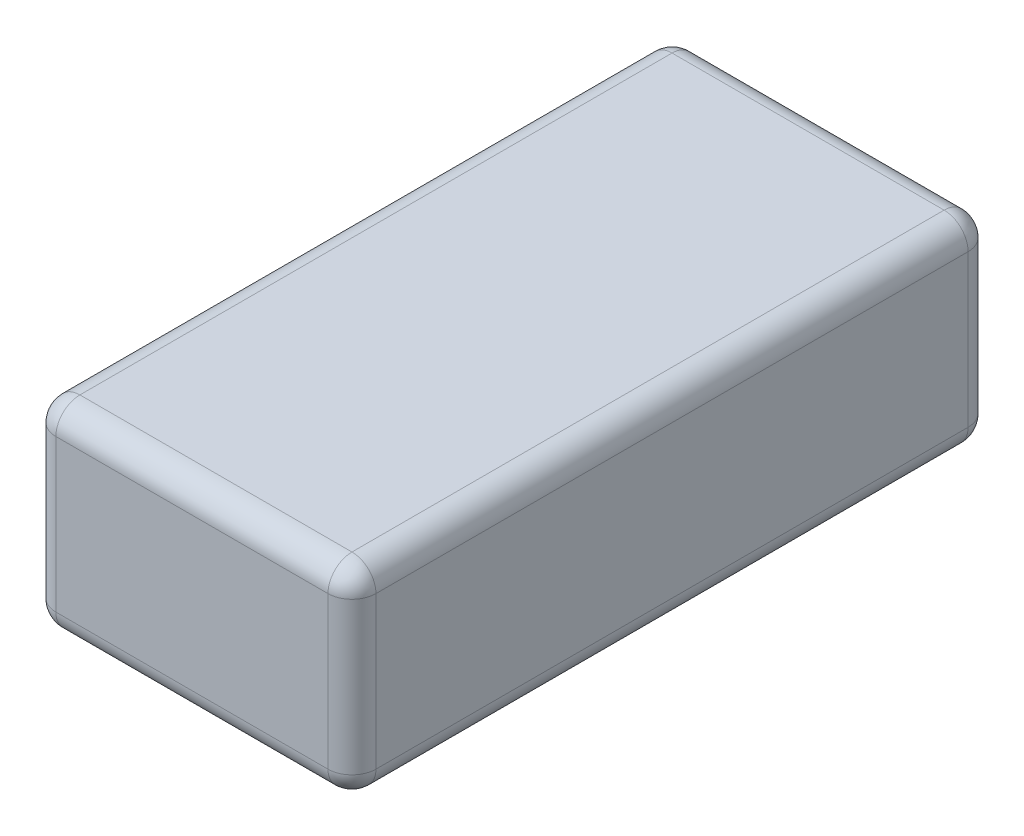
ISO-10303-21;
HEADER;
FILE_DESCRIPTION(('STEP AP214'),'2;1');
FILE_NAME('part.step','',(''),(''),'','','');
FILE_SCHEMA(('AUTOMOTIVE_DESIGN { 1 0 10303 214 1 1 1 1 }'));
ENDSEC;
DATA;
#1=APPLICATION_CONTEXT('core data for automotive mechanical design processes');
#2=APPLICATION_PROTOCOL_DEFINITION('international standard','automotive_design',2000,#1);
#3=PRODUCT_CONTEXT('',#1,'mechanical');
#4=PRODUCT('Part','Part','',(#3));
#5=PRODUCT_RELATED_PRODUCT_CATEGORY('part','',(#4));
#6=PRODUCT_DEFINITION_FORMATION('','',#4);
#7=PRODUCT_DEFINITION_CONTEXT('part definition',#1,'design');
#8=PRODUCT_DEFINITION('design','',#6,#7);
#9=PRODUCT_DEFINITION_SHAPE('','',#8);
#10=(LENGTH_UNIT() NAMED_UNIT(*) SI_UNIT(.MILLI.,.METRE.));
#11=(NAMED_UNIT(*) PLANE_ANGLE_UNIT() SI_UNIT($,.RADIAN.));
#12=(NAMED_UNIT(*) SI_UNIT($,.STERADIAN.) SOLID_ANGLE_UNIT());
#13=UNCERTAINTY_MEASURE_WITH_UNIT(LENGTH_MEASURE(1.E-05),#10,'distance_accuracy_value','');
#14=(GEOMETRIC_REPRESENTATION_CONTEXT(3) GLOBAL_UNCERTAINTY_ASSIGNED_CONTEXT((#13)) GLOBAL_UNIT_ASSIGNED_CONTEXT((#10,
#11,#12)) REPRESENTATION_CONTEXT('',''));
#15=CARTESIAN_POINT('',(0.,0.,0.));
#16=DIRECTION('',(0.,0.,1.));
#17=DIRECTION('',(1.,0.,0.));
#18=AXIS2_PLACEMENT_3D('',#15,#16,#17);
#19=CARTESIAN_POINT('',(20.,25.,-40.));
#20=DIRECTION('',(-1.,0.,0.));
#21=DIRECTION('',(0.,0.,1.));
#22=AXIS2_PLACEMENT_3D('',#19,#20,#21);
#23=PLANE('',#22);
#24=DIRECTION('',(0.,-1.,0.));
#25=VECTOR('',#24,1.);
#26=CARTESIAN_POINT('',(20.,25.,-37.));
#27=LINE('',#26,#25);
#28=CARTESIAN_POINT('',(20.,3.,-37.));
#29=VERTEX_POINT('',#28);
#30=CARTESIAN_POINT('',(20.,22.,-37.));
#31=VERTEX_POINT('',#30);
#32=EDGE_CURVE('E133',#29,#31,#27,.F.);
#33=ORIENTED_EDGE('',*,*,#32,.T.);
#34=DIRECTION('',(0.,0.,-1.));
#35=VECTOR('',#34,1.);
#36=CARTESIAN_POINT('',(20.,22.,40.));
#37=LINE('',#36,#35);
#38=CARTESIAN_POINT('',(20.,22.,37.));
#39=VERTEX_POINT('',#38);
#40=EDGE_CURVE('E170',#31,#39,#37,.F.);
#41=ORIENTED_EDGE('',*,*,#40,.T.);
#42=DIRECTION('',(0.,-1.,0.));
#43=VECTOR('',#42,1.);
#44=CARTESIAN_POINT('',(20.,25.,37.));
#45=LINE('',#44,#43);
#46=CARTESIAN_POINT('',(20.,3.,37.));
#47=VERTEX_POINT('',#46);
#48=EDGE_CURVE('E167',#39,#47,#45,.T.);
#49=ORIENTED_EDGE('',*,*,#48,.T.);
#50=DIRECTION('',(0.,0.,-1.));
#51=VECTOR('',#50,1.);
#52=CARTESIAN_POINT('',(20.,3.,-40.));
#53=LINE('',#52,#51);
#54=EDGE_CURVE('E162',#47,#29,#53,.T.);
#55=ORIENTED_EDGE('',*,*,#54,.T.);
#56=EDGE_LOOP('',(#33,#41,#49,#55));
#57=FACE_BOUND('',#56,.T.);
#58=ADVANCED_FACE('F38',(#57),#23,.F.);
#59=CARTESIAN_POINT('',(-20.,25.,-40.));
#60=DIRECTION('',(0.,0.,1.));
#61=DIRECTION('',(1.,0.,0.));
#62=AXIS2_PLACEMENT_3D('',#59,#60,#61);
#63=PLANE('',#62);
#64=DIRECTION('',(0.,-1.,0.));
#65=VECTOR('',#64,1.);
#66=CARTESIAN_POINT('',(-17.,25.,-40.));
#67=LINE('',#66,#65);
#68=CARTESIAN_POINT('',(-17.,3.,-40.));
#69=VERTEX_POINT('',#68);
#70=CARTESIAN_POINT('',(-17.,22.,-40.));
#71=VERTEX_POINT('',#70);
#72=EDGE_CURVE('E155',#69,#71,#67,.F.);
#73=ORIENTED_EDGE('',*,*,#72,.T.);
#74=DIRECTION('',(-1.,0.,0.));
#75=VECTOR('',#74,1.);
#76=CARTESIAN_POINT('',(20.,22.,-40.));
#77=LINE('',#76,#75);
#78=CARTESIAN_POINT('',(17.,22.,-40.));
#79=VERTEX_POINT('',#78);
#80=EDGE_CURVE('E159',#71,#79,#77,.F.);
#81=ORIENTED_EDGE('',*,*,#80,.T.);
#82=DIRECTION('',(0.,-1.,0.));
#83=VECTOR('',#82,1.);
#84=CARTESIAN_POINT('',(17.,25.,-40.));
#85=LINE('',#84,#83);
#86=CARTESIAN_POINT('',(17.,3.,-40.));
#87=VERTEX_POINT('',#86);
#88=EDGE_CURVE('E131',#79,#87,#85,.T.);
#89=ORIENTED_EDGE('',*,*,#88,.T.);
#90=DIRECTION('',(-1.,0.,0.));
#91=VECTOR('',#90,1.);
#92=CARTESIAN_POINT('',(-20.,3.,-40.));
#93=LINE('',#92,#91);
#94=EDGE_CURVE('E149',#87,#69,#93,.T.);
#95=ORIENTED_EDGE('',*,*,#94,.T.);
#96=EDGE_LOOP('',(#73,#81,#89,#95));
#97=FACE_BOUND('',#96,.T.);
#98=ADVANCED_FACE('F157',(#97),#63,.F.);
#99=CARTESIAN_POINT('',(-20.,25.,-40.));
#100=DIRECTION('',(1.,0.,0.));
#101=DIRECTION('',(0.,0.,-1.));
#102=AXIS2_PLACEMENT_3D('',#99,#100,#101);
#103=PLANE('',#102);
#104=DIRECTION('',(0.,-1.,0.));
#105=VECTOR('',#104,1.);
#106=CARTESIAN_POINT('',(-20.,25.,37.));
#107=LINE('',#106,#105);
#108=CARTESIAN_POINT('',(-20.,3.,37.));
#109=VERTEX_POINT('',#108);
#110=CARTESIAN_POINT('',(-20.,22.,37.));
#111=VERTEX_POINT('',#110);
#112=EDGE_CURVE('E174',#109,#111,#107,.F.);
#113=ORIENTED_EDGE('',*,*,#112,.T.);
#114=DIRECTION('',(0.,0.,1.));
#115=VECTOR('',#114,1.);
#116=CARTESIAN_POINT('',(-20.,22.,-40.));
#117=LINE('',#116,#115);
#118=CARTESIAN_POINT('',(-20.,22.,-37.));
#119=VERTEX_POINT('',#118);
#120=EDGE_CURVE('E179',#111,#119,#117,.F.);
#121=ORIENTED_EDGE('',*,*,#120,.T.);
#122=DIRECTION('',(0.,-1.,0.));
#123=VECTOR('',#122,1.);
#124=CARTESIAN_POINT('',(-20.,25.,-37.));
#125=LINE('',#124,#123);
#126=CARTESIAN_POINT('',(-20.,3.,-37.));
#127=VERTEX_POINT('',#126);
#128=EDGE_CURVE('E176',#119,#127,#125,.T.);
#129=ORIENTED_EDGE('',*,*,#128,.T.);
#130=DIRECTION('',(0.,0.,1.));
#131=VECTOR('',#130,1.);
#132=CARTESIAN_POINT('',(-20.,3.,-40.));
#133=LINE('',#132,#131);
#134=EDGE_CURVE('E172',#127,#109,#133,.T.);
#135=ORIENTED_EDGE('',*,*,#134,.T.);
#136=EDGE_LOOP('',(#113,#121,#129,#135));
#137=FACE_BOUND('',#136,.T.);
#138=ADVANCED_FACE('F284',(#137),#103,.F.);
#139=CARTESIAN_POINT('',(-20.,25.,40.));
#140=DIRECTION('',(0.,0.,-1.));
#141=DIRECTION('',(-1.,0.,0.));
#142=AXIS2_PLACEMENT_3D('',#139,#140,#141);
#143=PLANE('',#142);
#144=DIRECTION('',(0.,-1.,0.));
#145=VECTOR('',#144,1.);
#146=CARTESIAN_POINT('',(17.,25.,40.));
#147=LINE('',#146,#145);
#148=CARTESIAN_POINT('',(17.,3.,40.));
#149=VERTEX_POINT('',#148);
#150=CARTESIAN_POINT('',(17.,22.,40.));
#151=VERTEX_POINT('',#150);
#152=EDGE_CURVE('E183',#149,#151,#147,.F.);
#153=ORIENTED_EDGE('',*,*,#152,.T.);
#154=DIRECTION('',(1.,0.,0.));
#155=VECTOR('',#154,1.);
#156=CARTESIAN_POINT('',(-20.,22.,40.));
#157=LINE('',#156,#155);
#158=CARTESIAN_POINT('',(-17.,22.,40.));
#159=VERTEX_POINT('',#158);
#160=EDGE_CURVE('E188',#151,#159,#157,.F.);
#161=ORIENTED_EDGE('',*,*,#160,.T.);
#162=DIRECTION('',(0.,-1.,0.));
#163=VECTOR('',#162,1.);
#164=CARTESIAN_POINT('',(-17.,25.,40.));
#165=LINE('',#164,#163);
#166=CARTESIAN_POINT('',(-17.,3.,40.));
#167=VERTEX_POINT('',#166);
#168=EDGE_CURVE('E185',#159,#167,#165,.T.);
#169=ORIENTED_EDGE('',*,*,#168,.T.);
#170=DIRECTION('',(1.,0.,0.));
#171=VECTOR('',#170,1.);
#172=CARTESIAN_POINT('',(-20.,3.,40.));
#173=LINE('',#172,#171);
#174=EDGE_CURVE('E181',#167,#149,#173,.T.);
#175=ORIENTED_EDGE('',*,*,#174,.T.);
#176=EDGE_LOOP('',(#153,#161,#169,#175));
#177=FACE_BOUND('',#176,.T.);
#178=ADVANCED_FACE('F294',(#177),#143,.F.);
#179=CARTESIAN_POINT('',(0.,25.,0.));
#180=DIRECTION('',(0.,1.,0.));
#181=DIRECTION('',(0.,0.,1.));
#182=AXIS2_PLACEMENT_3D('',#179,#180,#181);
#183=PLANE('',#182);
#184=DIRECTION('',(0.,0.,1.));
#185=VECTOR('',#184,1.);
#186=CARTESIAN_POINT('',(-17.,25.,40.));
#187=LINE('',#186,#185);
#188=CARTESIAN_POINT('',(-17.,25.,-37.));
#189=VERTEX_POINT('',#188);
#190=CARTESIAN_POINT('',(-17.,25.,37.));
#191=VERTEX_POINT('',#190);
#192=EDGE_CURVE('E194',#189,#191,#187,.T.);
#193=ORIENTED_EDGE('',*,*,#192,.T.);
#194=DIRECTION('',(1.,0.,0.));
#195=VECTOR('',#194,1.);
#196=CARTESIAN_POINT('',(20.,25.,37.));
#197=LINE('',#196,#195);
#198=CARTESIAN_POINT('',(17.,25.,37.));
#199=VERTEX_POINT('',#198);
#200=EDGE_CURVE('E196',#191,#199,#197,.T.);
#201=ORIENTED_EDGE('',*,*,#200,.T.);
#202=DIRECTION('',(0.,0.,-1.));
#203=VECTOR('',#202,1.);
#204=CARTESIAN_POINT('',(17.,25.,-40.));
#205=LINE('',#204,#203);
#206=CARTESIAN_POINT('',(17.,25.,-37.));
#207=VERTEX_POINT('',#206);
#208=EDGE_CURVE('E190',#199,#207,#205,.T.);
#209=ORIENTED_EDGE('',*,*,#208,.T.);
#210=DIRECTION('',(-1.,0.,0.));
#211=VECTOR('',#210,1.);
#212=CARTESIAN_POINT('',(-20.,25.,-37.));
#213=LINE('',#212,#211);
#214=EDGE_CURVE('E192',#207,#189,#213,.T.);
#215=ORIENTED_EDGE('',*,*,#214,.T.);
#216=EDGE_LOOP('',(#193,#201,#209,#215));
#217=FACE_BOUND('',#216,.T.);
#218=ADVANCED_FACE('F276',(#217),#183,.T.);
#219=CARTESIAN_POINT('',(0.,0.,0.));
#220=DIRECTION('',(0.,1.,0.));
#221=DIRECTION('',(0.,0.,1.));
#222=AXIS2_PLACEMENT_3D('',#219,#220,#221);
#223=PLANE('',#222);
#224=DIRECTION('',(0.,0.,-1.));
#225=VECTOR('',#224,1.);
#226=CARTESIAN_POINT('',(17.,0.,0.));
#227=LINE('',#226,#225);
#228=CARTESIAN_POINT('',(17.,0.,-37.));
#229=VERTEX_POINT('',#228);
#230=CARTESIAN_POINT('',(17.,0.,37.));
#231=VERTEX_POINT('',#230);
#232=EDGE_CURVE('E199',#229,#231,#227,.F.);
#233=ORIENTED_EDGE('',*,*,#232,.T.);
#234=DIRECTION('',(1.,0.,0.));
#235=VECTOR('',#234,1.);
#236=CARTESIAN_POINT('',(0.,0.,37.));
#237=LINE('',#236,#235);
#238=CARTESIAN_POINT('',(-17.,0.,37.));
#239=VERTEX_POINT('',#238);
#240=EDGE_CURVE('E11',#231,#239,#237,.F.);
#241=ORIENTED_EDGE('',*,*,#240,.T.);
#242=DIRECTION('',(0.,0.,1.));
#243=VECTOR('',#242,1.);
#244=CARTESIAN_POINT('',(-17.,0.,0.));
#245=LINE('',#244,#243);
#246=CARTESIAN_POINT('',(-17.,0.,-37.));
#247=VERTEX_POINT('',#246);
#248=EDGE_CURVE('E47',#239,#247,#245,.F.);
#249=ORIENTED_EDGE('',*,*,#248,.T.);
#250=DIRECTION('',(-1.,0.,0.));
#251=VECTOR('',#250,1.);
#252=CARTESIAN_POINT('',(0.,0.,-37.));
#253=LINE('',#252,#251);
#254=EDGE_CURVE('E201',#247,#229,#253,.F.);
#255=ORIENTED_EDGE('',*,*,#254,.T.);
#256=EDGE_LOOP('',(#233,#241,#249,#255));
#257=FACE_BOUND('',#256,.T.);
#258=ADVANCED_FACE('F521',(#257),#223,.F.);
#259=CARTESIAN_POINT('',(-17.,25.,37.));
#260=DIRECTION('',(0.,-1.,0.));
#261=DIRECTION('',(0.,0.,-1.));
#262=AXIS2_PLACEMENT_3D('',#259,#260,#261);
#263=CYLINDRICAL_SURFACE('',#262,3.);
#264=CARTESIAN_POINT('',(-17.,22.,37.));
#265=DIRECTION('',(0.,1.,0.));
#266=DIRECTION('',(0.,0.,1.));
#267=AXIS2_PLACEMENT_3D('',#264,#265,#266);
#268=CIRCLE('',#267,3.);
#269=EDGE_CURVE('E42',#111,#159,#268,.T.);
#270=ORIENTED_EDGE('',*,*,#269,.F.);
#271=ORIENTED_EDGE('',*,*,#112,.F.);
#272=CARTESIAN_POINT('',(-17.,3.,37.));
#273=DIRECTION('',(0.,-1.,0.));
#274=DIRECTION('',(0.,0.,-1.));
#275=AXIS2_PLACEMENT_3D('',#272,#273,#274);
#276=CIRCLE('',#275,3.);
#277=EDGE_CURVE('E254',#167,#109,#276,.T.);
#278=ORIENTED_EDGE('',*,*,#277,.F.);
#279=ORIENTED_EDGE('',*,*,#168,.F.);
#280=EDGE_LOOP('',(#270,#271,#278,#279));
#281=FACE_BOUND('',#280,.T.);
#282=ADVANCED_FACE('F40',(#281),#263,.T.);
#283=CARTESIAN_POINT('',(-17.,22.,37.));
#284=DIRECTION('',(0.,0.,1.));
#285=DIRECTION('',(1.,0.,0.));
#286=AXIS2_PLACEMENT_3D('',#283,#284,#285);
#287=SPHERICAL_SURFACE('',#286,3.);
#288=CARTESIAN_POINT('',(-17.,22.,37.));
#289=DIRECTION('',(0.,0.,1.));
#290=DIRECTION('',(1.,0.,0.));
#291=AXIS2_PLACEMENT_3D('',#288,#289,#290);
#292=CIRCLE('',#291,3.);
#293=EDGE_CURVE('E249',#111,#191,#292,.F.);
#294=ORIENTED_EDGE('',*,*,#293,.F.);
#295=ORIENTED_EDGE('',*,*,#269,.T.);
#296=CARTESIAN_POINT('',(-17.,22.,37.));
#297=DIRECTION('',(-1.,0.,0.));
#298=DIRECTION('',(0.,0.,1.));
#299=AXIS2_PLACEMENT_3D('',#296,#297,#298);
#300=CIRCLE('',#299,3.);
#301=EDGE_CURVE('E252',#191,#159,#300,.F.);
#302=ORIENTED_EDGE('',*,*,#301,.F.);
#303=EDGE_LOOP('',(#294,#295,#302));
#304=FACE_BOUND('',#303,.T.);
#305=ADVANCED_FACE('F264',(#304),#287,.T.);
#306=CARTESIAN_POINT('',(-17.,3.,37.));
#307=DIRECTION('',(0.,0.,1.));
#308=DIRECTION('',(1.,0.,0.));
#309=AXIS2_PLACEMENT_3D('',#306,#307,#308);
#310=SPHERICAL_SURFACE('',#309,3.);
#311=CARTESIAN_POINT('',(-17.,3.,37.));
#312=DIRECTION('',(-1.,0.,0.));
#313=DIRECTION('',(0.,0.,1.));
#314=AXIS2_PLACEMENT_3D('',#311,#312,#313);
#315=CIRCLE('',#314,3.);
#316=EDGE_CURVE('E244',#167,#239,#315,.F.);
#317=ORIENTED_EDGE('',*,*,#316,.F.);
#318=ORIENTED_EDGE('',*,*,#277,.T.);
#319=CARTESIAN_POINT('',(-17.,3.,37.));
#320=DIRECTION('',(0.,0.,1.));
#321=DIRECTION('',(1.,0.,0.));
#322=AXIS2_PLACEMENT_3D('',#319,#320,#321);
#323=CIRCLE('',#322,3.);
#324=EDGE_CURVE('E247',#239,#109,#323,.F.);
#325=ORIENTED_EDGE('',*,*,#324,.F.);
#326=EDGE_LOOP('',(#317,#318,#325));
#327=FACE_BOUND('',#326,.T.);
#328=ADVANCED_FACE('F494',(#327),#310,.T.);
#329=CARTESIAN_POINT('',(0.,22.,37.));
#330=DIRECTION('',(-1.,0.,0.));
#331=DIRECTION('',(0.,0.,1.));
#332=AXIS2_PLACEMENT_3D('',#329,#330,#331);
#333=CYLINDRICAL_SURFACE('',#332,3.);
#334=ORIENTED_EDGE('',*,*,#301,.T.);
#335=ORIENTED_EDGE('',*,*,#160,.F.);
#336=CARTESIAN_POINT('',(17.,22.,37.));
#337=DIRECTION('',(1.,0.,0.));
#338=DIRECTION('',(0.,0.,-1.));
#339=AXIS2_PLACEMENT_3D('',#336,#337,#338);
#340=CIRCLE('',#339,3.);
#341=EDGE_CURVE('E238',#199,#151,#340,.T.);
#342=ORIENTED_EDGE('',*,*,#341,.F.);
#343=ORIENTED_EDGE('',*,*,#200,.F.);
#344=EDGE_LOOP('',(#334,#335,#342,#343));
#345=FACE_BOUND('',#344,.T.);
#346=ADVANCED_FACE('F272',(#345),#333,.T.);
#347=CARTESIAN_POINT('',(-17.,22.,0.));
#348=DIRECTION('',(0.,0.,-1.));
#349=DIRECTION('',(-1.,0.,0.));
#350=AXIS2_PLACEMENT_3D('',#347,#348,#349);
#351=CYLINDRICAL_SURFACE('',#350,3.);
#352=ORIENTED_EDGE('',*,*,#293,.T.);
#353=ORIENTED_EDGE('',*,*,#192,.F.);
#354=CARTESIAN_POINT('',(-17.,22.,-37.));
#355=DIRECTION('',(0.,0.,-1.));
#356=DIRECTION('',(-1.,0.,0.));
#357=AXIS2_PLACEMENT_3D('',#354,#355,#356);
#358=CIRCLE('',#357,3.);
#359=EDGE_CURVE('E235',#119,#189,#358,.T.);
#360=ORIENTED_EDGE('',*,*,#359,.F.);
#361=ORIENTED_EDGE('',*,*,#120,.F.);
#362=EDGE_LOOP('',(#352,#353,#360,#361));
#363=FACE_BOUND('',#362,.T.);
#364=ADVANCED_FACE('F281',(#363),#351,.T.);
#365=CARTESIAN_POINT('',(-17.,25.,-37.));
#366=DIRECTION('',(0.,-1.,0.));
#367=DIRECTION('',(0.,0.,-1.));
#368=AXIS2_PLACEMENT_3D('',#365,#366,#367);
#369=CYLINDRICAL_SURFACE('',#368,3.);
#370=CARTESIAN_POINT('',(-17.,3.,-37.));
#371=DIRECTION('',(0.,-1.,0.));
#372=DIRECTION('',(0.,0.,-1.));
#373=AXIS2_PLACEMENT_3D('',#370,#371,#372);
#374=CIRCLE('',#373,3.);
#375=EDGE_CURVE('E229',#127,#69,#374,.T.);
#376=ORIENTED_EDGE('',*,*,#375,.F.);
#377=ORIENTED_EDGE('',*,*,#128,.F.);
#378=CARTESIAN_POINT('',(-17.,22.,-37.));
#379=DIRECTION('',(0.,1.,0.));
#380=DIRECTION('',(0.,0.,1.));
#381=AXIS2_PLACEMENT_3D('',#378,#379,#380);
#382=CIRCLE('',#381,3.);
#383=EDGE_CURVE('E232',#71,#119,#382,.T.);
#384=ORIENTED_EDGE('',*,*,#383,.F.);
#385=ORIENTED_EDGE('',*,*,#72,.F.);
#386=EDGE_LOOP('',(#376,#377,#384,#385));
#387=FACE_BOUND('',#386,.T.);
#388=ADVANCED_FACE('F288',(#387),#369,.T.);
#389=CARTESIAN_POINT('',(-17.,3.,-40.));
#390=DIRECTION('',(0.,0.,1.));
#391=DIRECTION('',(1.,0.,0.));
#392=AXIS2_PLACEMENT_3D('',#389,#390,#391);
#393=CYLINDRICAL_SURFACE('',#392,3.);
#394=ORIENTED_EDGE('',*,*,#324,.T.);
#395=ORIENTED_EDGE('',*,*,#134,.F.);
#396=CARTESIAN_POINT('',(-17.,3.,-37.));
#397=DIRECTION('',(0.,0.,-1.));
#398=DIRECTION('',(-1.,0.,0.));
#399=AXIS2_PLACEMENT_3D('',#396,#397,#398);
#400=CIRCLE('',#399,3.);
#401=EDGE_CURVE('E227',#247,#127,#400,.T.);
#402=ORIENTED_EDGE('',*,*,#401,.F.);
#403=ORIENTED_EDGE('',*,*,#248,.F.);
#404=EDGE_LOOP('',(#394,#395,#402,#403));
#405=FACE_BOUND('',#404,.T.);
#406=ADVANCED_FACE('F292',(#405),#393,.T.);
#407=CARTESIAN_POINT('',(-20.,3.,37.));
#408=DIRECTION('',(1.,0.,0.));
#409=DIRECTION('',(0.,0.,-1.));
#410=AXIS2_PLACEMENT_3D('',#407,#408,#409);
#411=CYLINDRICAL_SURFACE('',#410,3.);
#412=ORIENTED_EDGE('',*,*,#316,.T.);
#413=ORIENTED_EDGE('',*,*,#240,.F.);
#414=CARTESIAN_POINT('',(17.,3.,37.));
#415=DIRECTION('',(1.,0.,0.));
#416=DIRECTION('',(0.,0.,-1.));
#417=AXIS2_PLACEMENT_3D('',#414,#415,#416);
#418=CIRCLE('',#417,3.);
#419=EDGE_CURVE('E224',#149,#231,#418,.T.);
#420=ORIENTED_EDGE('',*,*,#419,.F.);
#421=ORIENTED_EDGE('',*,*,#174,.F.);
#422=EDGE_LOOP('',(#412,#413,#420,#421));
#423=FACE_BOUND('',#422,.T.);
#424=ADVANCED_FACE('F304',(#423),#411,.T.);
#425=CARTESIAN_POINT('',(17.,25.,37.));
#426=DIRECTION('',(0.,-1.,0.));
#427=DIRECTION('',(0.,0.,-1.));
#428=AXIS2_PLACEMENT_3D('',#425,#426,#427);
#429=CYLINDRICAL_SURFACE('',#428,3.);
#430=CARTESIAN_POINT('',(17.,22.,37.));
#431=DIRECTION('',(0.,1.,0.));
#432=DIRECTION('',(0.,0.,1.));
#433=AXIS2_PLACEMENT_3D('',#430,#431,#432);
#434=CIRCLE('',#433,3.);
#435=EDGE_CURVE('E241',#151,#39,#434,.T.);
#436=ORIENTED_EDGE('',*,*,#435,.F.);
#437=ORIENTED_EDGE('',*,*,#152,.F.);
#438=CARTESIAN_POINT('',(17.,3.,37.));
#439=DIRECTION('',(0.,-1.,0.));
#440=DIRECTION('',(0.,0.,-1.));
#441=AXIS2_PLACEMENT_3D('',#438,#439,#440);
#442=CIRCLE('',#441,3.);
#443=EDGE_CURVE('E221',#47,#149,#442,.T.);
#444=ORIENTED_EDGE('',*,*,#443,.F.);
#445=ORIENTED_EDGE('',*,*,#48,.F.);
#446=EDGE_LOOP('',(#436,#437,#444,#445));
#447=FACE_BOUND('',#446,.T.);
#448=ADVANCED_FACE('F299',(#447),#429,.T.);
#449=CARTESIAN_POINT('',(17.,22.,37.));
#450=DIRECTION('',(0.,0.,1.));
#451=DIRECTION('',(1.,0.,0.));
#452=AXIS2_PLACEMENT_3D('',#449,#450,#451);
#453=SPHERICAL_SURFACE('',#452,3.);
#454=ORIENTED_EDGE('',*,*,#341,.T.);
#455=ORIENTED_EDGE('',*,*,#435,.T.);
#456=CARTESIAN_POINT('',(17.,22.,37.));
#457=DIRECTION('',(0.,0.,1.));
#458=DIRECTION('',(1.,0.,0.));
#459=AXIS2_PLACEMENT_3D('',#456,#457,#458);
#460=CIRCLE('',#459,3.);
#461=EDGE_CURVE('E218',#199,#39,#460,.F.);
#462=ORIENTED_EDGE('',*,*,#461,.F.);
#463=EDGE_LOOP('',(#454,#455,#462));
#464=FACE_BOUND('',#463,.T.);
#465=ADVANCED_FACE('F315',(#464),#453,.T.);
#466=CARTESIAN_POINT('',(-17.,22.,-37.));
#467=DIRECTION('',(0.,0.,1.));
#468=DIRECTION('',(1.,0.,0.));
#469=AXIS2_PLACEMENT_3D('',#466,#467,#468);
#470=SPHERICAL_SURFACE('',#469,3.);
#471=ORIENTED_EDGE('',*,*,#383,.T.);
#472=ORIENTED_EDGE('',*,*,#359,.T.);
#473=CARTESIAN_POINT('',(-17.,22.,-37.));
#474=DIRECTION('',(-1.,0.,0.));
#475=DIRECTION('',(0.,0.,1.));
#476=AXIS2_PLACEMENT_3D('',#473,#474,#475);
#477=CIRCLE('',#476,3.);
#478=EDGE_CURVE('E215',#71,#189,#477,.F.);
#479=ORIENTED_EDGE('',*,*,#478,.F.);
#480=EDGE_LOOP('',(#471,#472,#479));
#481=FACE_BOUND('',#480,.T.);
#482=ADVANCED_FACE('F325',(#481),#470,.T.);
#483=CARTESIAN_POINT('',(-17.,3.,-37.));
#484=DIRECTION('',(0.,0.,1.));
#485=DIRECTION('',(1.,0.,0.));
#486=AXIS2_PLACEMENT_3D('',#483,#484,#485);
#487=SPHERICAL_SURFACE('',#486,3.);
#488=ORIENTED_EDGE('',*,*,#401,.T.);
#489=ORIENTED_EDGE('',*,*,#375,.T.);
#490=CARTESIAN_POINT('',(-17.,3.,-37.));
#491=DIRECTION('',(-1.,0.,0.));
#492=DIRECTION('',(0.,0.,1.));
#493=AXIS2_PLACEMENT_3D('',#490,#491,#492);
#494=CIRCLE('',#493,3.);
#495=EDGE_CURVE('E152',#247,#69,#494,.F.);
#496=ORIENTED_EDGE('',*,*,#495,.F.);
#497=EDGE_LOOP('',(#488,#489,#496));
#498=FACE_BOUND('',#497,.T.);
#499=ADVANCED_FACE('F327',(#498),#487,.T.);
#500=CARTESIAN_POINT('',(17.,3.,37.));
#501=DIRECTION('',(0.,0.,1.));
#502=DIRECTION('',(1.,0.,0.));
#503=AXIS2_PLACEMENT_3D('',#500,#501,#502);
#504=SPHERICAL_SURFACE('',#503,3.);
#505=ORIENTED_EDGE('',*,*,#443,.T.);
#506=ORIENTED_EDGE('',*,*,#419,.T.);
#507=CARTESIAN_POINT('',(17.,3.,37.));
#508=DIRECTION('',(0.,0.,1.));
#509=DIRECTION('',(1.,0.,0.));
#510=AXIS2_PLACEMENT_3D('',#507,#508,#509);
#511=CIRCLE('',#510,3.);
#512=EDGE_CURVE('E211',#47,#231,#511,.F.);
#513=ORIENTED_EDGE('',*,*,#512,.F.);
#514=EDGE_LOOP('',(#505,#506,#513));
#515=FACE_BOUND('',#514,.T.);
#516=ADVANCED_FACE('F306',(#515),#504,.T.);
#517=CARTESIAN_POINT('',(17.,22.,0.));
#518=DIRECTION('',(0.,0.,1.));
#519=DIRECTION('',(1.,0.,0.));
#520=AXIS2_PLACEMENT_3D('',#517,#518,#519);
#521=CYLINDRICAL_SURFACE('',#520,3.);
#522=ORIENTED_EDGE('',*,*,#461,.T.);
#523=ORIENTED_EDGE('',*,*,#40,.F.);
#524=CARTESIAN_POINT('',(17.,22.,-37.));
#525=DIRECTION('',(0.,0.,-1.));
#526=DIRECTION('',(-1.,0.,0.));
#527=AXIS2_PLACEMENT_3D('',#524,#525,#526);
#528=CIRCLE('',#527,3.);
#529=EDGE_CURVE('E208',#207,#31,#528,.T.);
#530=ORIENTED_EDGE('',*,*,#529,.F.);
#531=ORIENTED_EDGE('',*,*,#208,.F.);
#532=EDGE_LOOP('',(#522,#523,#530,#531));
#533=FACE_BOUND('',#532,.T.);
#534=ADVANCED_FACE('F317',(#533),#521,.T.);
#535=CARTESIAN_POINT('',(0.,22.,-37.));
#536=DIRECTION('',(1.,0.,0.));
#537=DIRECTION('',(0.,0.,-1.));
#538=AXIS2_PLACEMENT_3D('',#535,#536,#537);
#539=CYLINDRICAL_SURFACE('',#538,3.);
#540=ORIENTED_EDGE('',*,*,#478,.T.);
#541=ORIENTED_EDGE('',*,*,#214,.F.);
#542=CARTESIAN_POINT('',(17.,22.,-37.));
#543=DIRECTION('',(1.,0.,0.));
#544=DIRECTION('',(0.,1.,0.));
#545=AXIS2_PLACEMENT_3D('',#542,#543,#544);
#546=CIRCLE('',#545,3.);
#547=EDGE_CURVE('E146',#79,#207,#546,.T.);
#548=ORIENTED_EDGE('',*,*,#547,.F.);
#549=ORIENTED_EDGE('',*,*,#80,.F.);
#550=EDGE_LOOP('',(#540,#541,#548,#549));
#551=FACE_BOUND('',#550,.T.);
#552=ADVANCED_FACE('F323',(#551),#539,.T.);
#553=CARTESIAN_POINT('',(-20.,3.,-37.));
#554=DIRECTION('',(-1.,0.,0.));
#555=DIRECTION('',(0.,0.,1.));
#556=AXIS2_PLACEMENT_3D('',#553,#554,#555);
#557=CYLINDRICAL_SURFACE('',#556,3.);
#558=ORIENTED_EDGE('',*,*,#495,.T.);
#559=ORIENTED_EDGE('',*,*,#94,.F.);
#560=CARTESIAN_POINT('',(17.,3.,-37.));
#561=DIRECTION('',(1.,0.,0.));
#562=DIRECTION('',(0.,0.,-1.));
#563=AXIS2_PLACEMENT_3D('',#560,#561,#562);
#564=CIRCLE('',#563,3.);
#565=EDGE_CURVE('E139',#229,#87,#564,.T.);
#566=ORIENTED_EDGE('',*,*,#565,.F.);
#567=ORIENTED_EDGE('',*,*,#254,.F.);
#568=EDGE_LOOP('',(#558,#559,#566,#567));
#569=FACE_BOUND('',#568,.T.);
#570=ADVANCED_FACE('F150',(#569),#557,.T.);
#571=CARTESIAN_POINT('',(17.,3.,-40.));
#572=DIRECTION('',(0.,0.,-1.));
#573=DIRECTION('',(-1.,0.,0.));
#574=AXIS2_PLACEMENT_3D('',#571,#572,#573);
#575=CYLINDRICAL_SURFACE('',#574,3.);
#576=ORIENTED_EDGE('',*,*,#512,.T.);
#577=ORIENTED_EDGE('',*,*,#232,.F.);
#578=CARTESIAN_POINT('',(17.,3.,-37.));
#579=DIRECTION('',(0.,0.,-1.));
#580=DIRECTION('',(-1.,0.,0.));
#581=AXIS2_PLACEMENT_3D('',#578,#579,#580);
#582=CIRCLE('',#581,3.);
#583=EDGE_CURVE('E143',#29,#229,#582,.T.);
#584=ORIENTED_EDGE('',*,*,#583,.F.);
#585=ORIENTED_EDGE('',*,*,#54,.F.);
#586=EDGE_LOOP('',(#576,#577,#584,#585));
#587=FACE_BOUND('',#586,.T.);
#588=ADVANCED_FACE('F310',(#587),#575,.T.);
#589=CARTESIAN_POINT('',(17.,22.,-37.));
#590=DIRECTION('',(0.,0.,1.));
#591=DIRECTION('',(1.,0.,0.));
#592=AXIS2_PLACEMENT_3D('',#589,#590,#591);
#593=SPHERICAL_SURFACE('',#592,3.);
#594=ORIENTED_EDGE('',*,*,#547,.T.);
#595=ORIENTED_EDGE('',*,*,#529,.T.);
#596=CARTESIAN_POINT('',(17.,22.,-37.));
#597=DIRECTION('',(0.,1.,0.));
#598=DIRECTION('',(0.,0.,1.));
#599=AXIS2_PLACEMENT_3D('',#596,#597,#598);
#600=CIRCLE('',#599,3.);
#601=EDGE_CURVE('E136',#79,#31,#600,.F.);
#602=ORIENTED_EDGE('',*,*,#601,.F.);
#603=EDGE_LOOP('',(#594,#595,#602));
#604=FACE_BOUND('',#603,.T.);
#605=ADVANCED_FACE('F321',(#604),#593,.T.);
#606=CARTESIAN_POINT('',(17.,3.,-37.));
#607=DIRECTION('',(0.,0.,1.));
#608=DIRECTION('',(1.,0.,0.));
#609=AXIS2_PLACEMENT_3D('',#606,#607,#608);
#610=SPHERICAL_SURFACE('',#609,3.);
#611=ORIENTED_EDGE('',*,*,#583,.T.);
#612=ORIENTED_EDGE('',*,*,#565,.T.);
#613=CARTESIAN_POINT('',(17.,3.,-37.));
#614=DIRECTION('',(0.,-1.,0.));
#615=DIRECTION('',(0.,0.,-1.));
#616=AXIS2_PLACEMENT_3D('',#613,#614,#615);
#617=CIRCLE('',#616,3.);
#618=EDGE_CURVE('E127',#29,#87,#617,.F.);
#619=ORIENTED_EDGE('',*,*,#618,.F.);
#620=EDGE_LOOP('',(#611,#612,#619));
#621=FACE_BOUND('',#620,.T.);
#622=ADVANCED_FACE('F141',(#621),#610,.T.);
#623=CARTESIAN_POINT('',(17.,25.,-37.));
#624=DIRECTION('',(0.,-1.,0.));
#625=DIRECTION('',(0.,0.,-1.));
#626=AXIS2_PLACEMENT_3D('',#623,#624,#625);
#627=CYLINDRICAL_SURFACE('',#626,3.);
#628=ORIENTED_EDGE('',*,*,#601,.T.);
#629=ORIENTED_EDGE('',*,*,#32,.F.);
#630=ORIENTED_EDGE('',*,*,#618,.T.);
#631=ORIENTED_EDGE('',*,*,#88,.F.);
#632=EDGE_LOOP('',(#628,#629,#630,#631));
#633=FACE_BOUND('',#632,.T.);
#634=ADVANCED_FACE('F129',(#633),#627,.T.);
#635=CLOSED_SHELL('',(#58,#98,#138,#178,#218,#258,#282,#305,#328,#346,#364,#388,#406,#424,#448,
#465,#482,#499,#516,#534,#552,#570,#588,#605,#622,#634));
#636=MANIFOLD_SOLID_BREP('B2',#635);
#637=ADVANCED_BREP_SHAPE_REPRESENTATION('',(#18,#636),#14);
#638=SHAPE_DEFINITION_REPRESENTATION(#9,#637);
ENDSEC;
END-ISO-10303-21;
